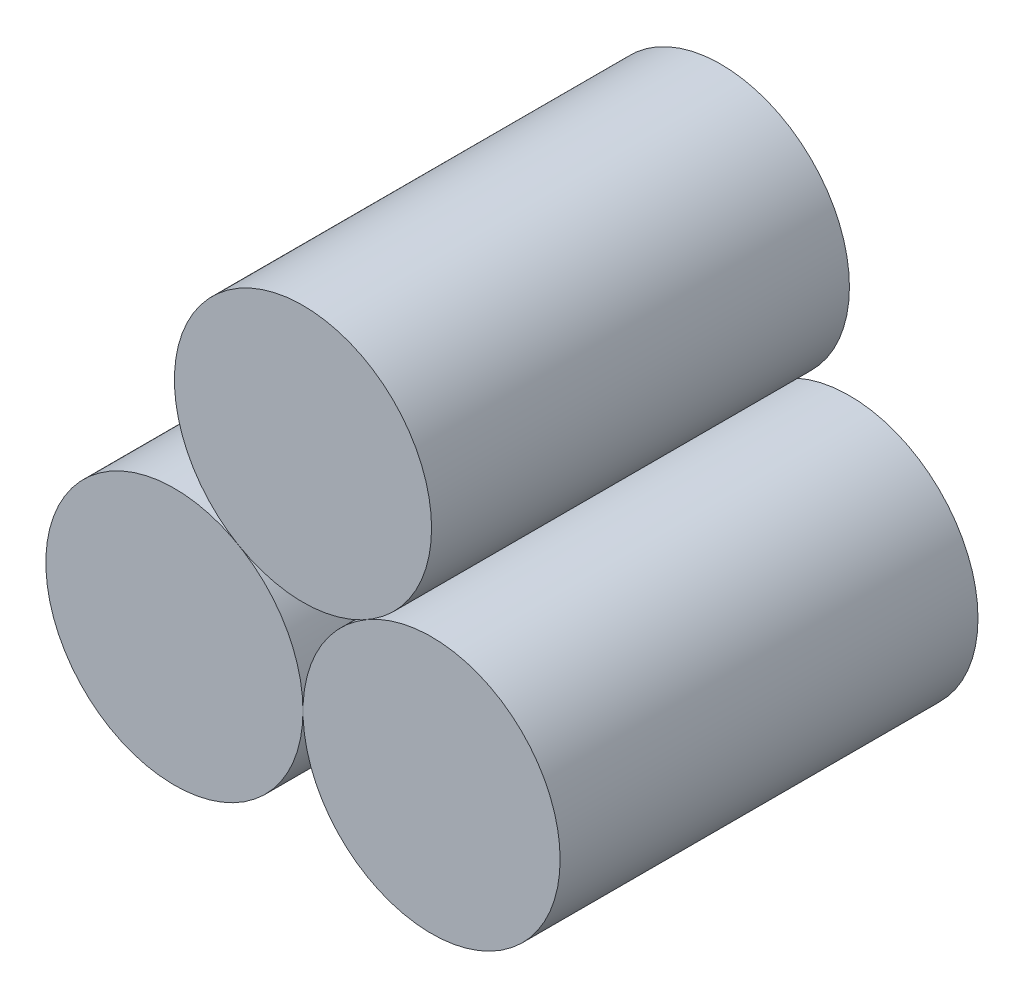
ISO-10303-21;
HEADER;
FILE_DESCRIPTION(('STEP AP214'),'2;1');
FILE_NAME('part.step','',(''),(''),'','','');
FILE_SCHEMA(('AUTOMOTIVE_DESIGN { 1 0 10303 214 1 1 1 1 }'));
ENDSEC;
DATA;
#1=APPLICATION_CONTEXT('core data for automotive mechanical design processes');
#2=APPLICATION_PROTOCOL_DEFINITION('international standard','automotive_design',2000,#1);
#3=PRODUCT_CONTEXT('',#1,'mechanical');
#4=PRODUCT('Part','Part','',(#3));
#5=PRODUCT_RELATED_PRODUCT_CATEGORY('part','',(#4));
#6=PRODUCT_DEFINITION_FORMATION('','',#4);
#7=PRODUCT_DEFINITION_CONTEXT('part definition',#1,'design');
#8=PRODUCT_DEFINITION('design','',#6,#7);
#9=PRODUCT_DEFINITION_SHAPE('','',#8);
#10=(LENGTH_UNIT() NAMED_UNIT(*) SI_UNIT(.MILLI.,.METRE.));
#11=(NAMED_UNIT(*) PLANE_ANGLE_UNIT() SI_UNIT($,.RADIAN.));
#12=(NAMED_UNIT(*) SI_UNIT($,.STERADIAN.) SOLID_ANGLE_UNIT());
#13=UNCERTAINTY_MEASURE_WITH_UNIT(LENGTH_MEASURE(1.E-05),#10,'distance_accuracy_value','');
#14=(GEOMETRIC_REPRESENTATION_CONTEXT(3) GLOBAL_UNCERTAINTY_ASSIGNED_CONTEXT((#13)) GLOBAL_UNIT_ASSIGNED_CONTEXT((#10,
#11,#12)) REPRESENTATION_CONTEXT('',''));
#15=CARTESIAN_POINT('',(0.,0.,0.));
#16=DIRECTION('',(0.,0.,1.));
#17=DIRECTION('',(1.,0.,0.));
#18=AXIS2_PLACEMENT_3D('',#15,#16,#17);
#19=CARTESIAN_POINT('',(2.,3.8349364905389,-4.));
#20=DIRECTION('',(0.,0.,1.));
#21=DIRECTION('',(1.,0.,0.));
#22=AXIS2_PLACEMENT_3D('',#19,#20,#21);
#23=CYLINDRICAL_SURFACE('',#22,2.);
#24=CARTESIAN_POINT('',(2.,3.8349364905389,-4.));
#25=DIRECTION('',(0.,0.,1.));
#26=DIRECTION('',(1.,0.,0.));
#27=AXIS2_PLACEMENT_3D('',#24,#25,#26);
#28=CIRCLE('',#27,2.);
#29=CARTESIAN_POINT('',(4.,3.8349364905389,-4.));
#30=VERTEX_POINT('',#29);
#31=EDGE_CURVE('E12',#30,#30,#28,.T.);
#32=ORIENTED_EDGE('',*,*,#31,.T.);
#33=EDGE_LOOP('',(#32));
#34=FACE_BOUND('',#33,.T.);
#35=CARTESIAN_POINT('',(2.,3.8349364905389,2.5));
#36=DIRECTION('',(0.,0.,1.));
#37=DIRECTION('',(1.,0.,0.));
#38=AXIS2_PLACEMENT_3D('',#35,#36,#37);
#39=CIRCLE('',#38,2.);
#40=CARTESIAN_POINT('',(4.,3.8349364905389,2.5));
#41=VERTEX_POINT('',#40);
#42=EDGE_CURVE('E87',#41,#41,#39,.T.);
#43=ORIENTED_EDGE('',*,*,#42,.F.);
#44=EDGE_LOOP('',(#43));
#45=FACE_BOUND('',#44,.T.);
#46=ADVANCED_FACE('F81',(#34,#45),#23,.T.);
#47=CARTESIAN_POINT('',(0.,0.,-4.));
#48=DIRECTION('',(0.,0.,1.));
#49=DIRECTION('',(1.,0.,0.));
#50=AXIS2_PLACEMENT_3D('',#47,#48,#49);
#51=PLANE('',#50);
#52=ORIENTED_EDGE('',*,*,#31,.F.);
#53=EDGE_LOOP('',(#52));
#54=FACE_BOUND('',#53,.T.);
#55=ADVANCED_FACE('F96',(#54),#51,.F.);
#56=CARTESIAN_POINT('',(0.,0.,2.5));
#57=DIRECTION('',(0.,0.,1.));
#58=DIRECTION('',(1.,0.,0.));
#59=AXIS2_PLACEMENT_3D('',#56,#57,#58);
#60=PLANE('',#59);
#61=ORIENTED_EDGE('',*,*,#42,.T.);
#62=EDGE_LOOP('',(#61));
#63=FACE_BOUND('',#62,.T.);
#64=ADVANCED_FACE('F93',(#63),#60,.T.);
#65=CLOSED_SHELL('',(#46,#55,#64));
#66=MANIFOLD_SOLID_BREP('B2',#65);
#67=CARTESIAN_POINT('',(0.,7.29903810567666,-4.));
#68=DIRECTION('',(0.,0.,1.));
#69=DIRECTION('',(1.,0.,0.));
#70=AXIS2_PLACEMENT_3D('',#67,#68,#69);
#71=CYLINDRICAL_SURFACE('',#70,2.);
#72=CARTESIAN_POINT('',(0.,7.29903810567666,-4.));
#73=DIRECTION('',(0.,0.,1.));
#74=DIRECTION('',(1.,0.,0.));
#75=AXIS2_PLACEMENT_3D('',#72,#73,#74);
#76=CIRCLE('',#75,2.);
#77=CARTESIAN_POINT('',(2.,7.29903810567666,-4.));
#78=VERTEX_POINT('',#77);
#79=EDGE_CURVE('E80',#78,#78,#76,.T.);
#80=ORIENTED_EDGE('',*,*,#79,.T.);
#81=EDGE_LOOP('',(#80));
#82=FACE_BOUND('',#81,.T.);
#83=CARTESIAN_POINT('',(0.,7.29903810567666,2.5));
#84=DIRECTION('',(0.,0.,1.));
#85=DIRECTION('',(1.,0.,0.));
#86=AXIS2_PLACEMENT_3D('',#83,#84,#85);
#87=CIRCLE('',#86,2.);
#88=CARTESIAN_POINT('',(2.,7.29903810567666,2.5));
#89=VERTEX_POINT('',#88);
#90=EDGE_CURVE('E134',#89,#89,#87,.T.);
#91=ORIENTED_EDGE('',*,*,#90,.F.);
#92=EDGE_LOOP('',(#91));
#93=FACE_BOUND('',#92,.T.);
#94=ADVANCED_FACE('F128',(#82,#93),#71,.T.);
#95=CARTESIAN_POINT('',(0.,0.,-4.));
#96=DIRECTION('',(0.,0.,1.));
#97=DIRECTION('',(1.,0.,0.));
#98=AXIS2_PLACEMENT_3D('',#95,#96,#97);
#99=PLANE('',#98);
#100=ORIENTED_EDGE('',*,*,#79,.F.);
#101=EDGE_LOOP('',(#100));
#102=FACE_BOUND('',#101,.T.);
#103=ADVANCED_FACE('F143',(#102),#99,.F.);
#104=CARTESIAN_POINT('',(0.,0.,2.5));
#105=DIRECTION('',(0.,0.,1.));
#106=DIRECTION('',(1.,0.,0.));
#107=AXIS2_PLACEMENT_3D('',#104,#105,#106);
#108=PLANE('',#107);
#109=ORIENTED_EDGE('',*,*,#90,.T.);
#110=EDGE_LOOP('',(#109));
#111=FACE_BOUND('',#110,.T.);
#112=ADVANCED_FACE('F140',(#111),#108,.T.);
#113=CLOSED_SHELL('',(#94,#103,#112));
#114=MANIFOLD_SOLID_BREP('B7',#113);
#115=CARTESIAN_POINT('',(-2.,3.8349364905389,-4.));
#116=DIRECTION('',(0.,0.,1.));
#117=DIRECTION('',(1.,0.,0.));
#118=AXIS2_PLACEMENT_3D('',#115,#116,#117);
#119=CYLINDRICAL_SURFACE('',#118,2.);
#120=CARTESIAN_POINT('',(-2.,3.8349364905389,-4.));
#121=DIRECTION('',(0.,0.,1.));
#122=DIRECTION('',(1.,0.,0.));
#123=AXIS2_PLACEMENT_3D('',#120,#121,#122);
#124=CIRCLE('',#123,2.);
#125=CARTESIAN_POINT('',(0.,3.8349364905389,-4.));
#126=VERTEX_POINT('',#125);
#127=EDGE_CURVE('E127',#126,#126,#124,.T.);
#128=ORIENTED_EDGE('',*,*,#127,.T.);
#129=EDGE_LOOP('',(#128));
#130=FACE_BOUND('',#129,.T.);
#131=CARTESIAN_POINT('',(-2.,3.8349364905389,2.5));
#132=DIRECTION('',(0.,0.,1.));
#133=DIRECTION('',(1.,0.,0.));
#134=AXIS2_PLACEMENT_3D('',#131,#132,#133);
#135=CIRCLE('',#134,2.);
#136=CARTESIAN_POINT('',(0.,3.8349364905389,2.5));
#137=VERTEX_POINT('',#136);
#138=EDGE_CURVE('E174',#137,#137,#135,.T.);
#139=ORIENTED_EDGE('',*,*,#138,.F.);
#140=EDGE_LOOP('',(#139));
#141=FACE_BOUND('',#140,.T.);
#142=ADVANCED_FACE('F168',(#130,#141),#119,.T.);
#143=CARTESIAN_POINT('',(0.,0.,-4.));
#144=DIRECTION('',(0.,0.,1.));
#145=DIRECTION('',(1.,0.,0.));
#146=AXIS2_PLACEMENT_3D('',#143,#144,#145);
#147=PLANE('',#146);
#148=ORIENTED_EDGE('',*,*,#127,.F.);
#149=EDGE_LOOP('',(#148));
#150=FACE_BOUND('',#149,.T.);
#151=ADVANCED_FACE('F183',(#150),#147,.F.);
#152=CARTESIAN_POINT('',(0.,0.,2.5));
#153=DIRECTION('',(0.,0.,1.));
#154=DIRECTION('',(1.,0.,0.));
#155=AXIS2_PLACEMENT_3D('',#152,#153,#154);
#156=PLANE('',#155);
#157=ORIENTED_EDGE('',*,*,#138,.T.);
#158=EDGE_LOOP('',(#157));
#159=FACE_BOUND('',#158,.T.);
#160=ADVANCED_FACE('F180',(#159),#156,.T.);
#161=CLOSED_SHELL('',(#142,#151,#160));
#162=MANIFOLD_SOLID_BREP('B75',#161);
#163=ADVANCED_BREP_SHAPE_REPRESENTATION('',(#18,#66,#114,#162),#14);
#164=SHAPE_DEFINITION_REPRESENTATION(#9,#163);
ENDSEC;
END-ISO-10303-21;
